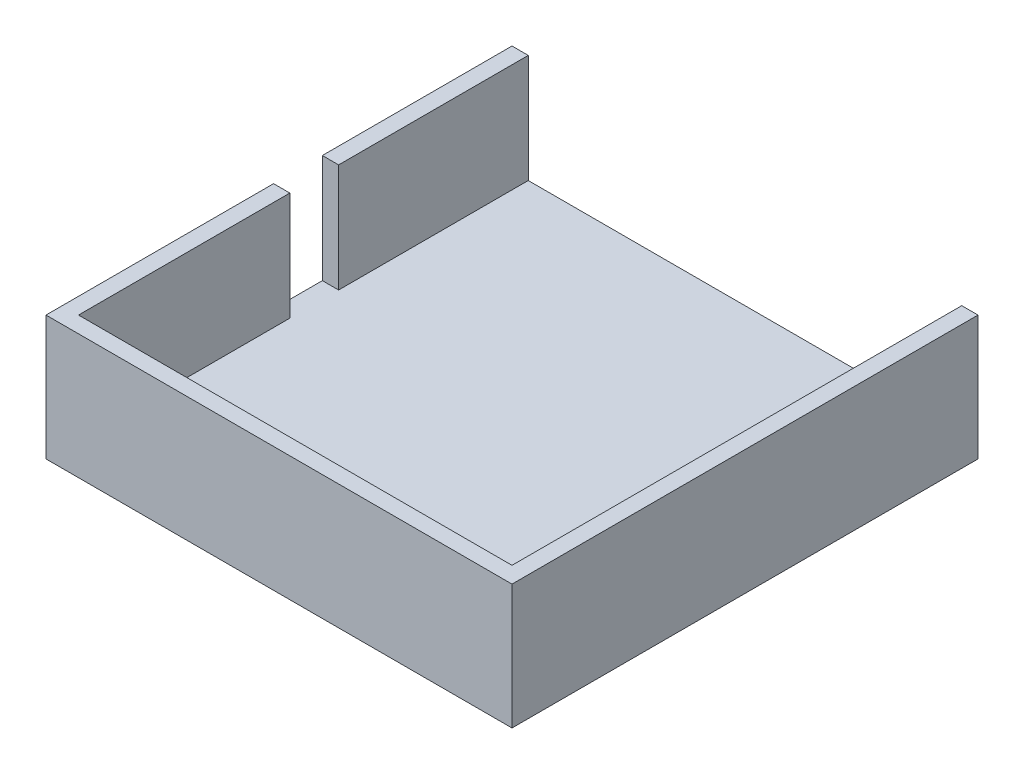
ISO-10303-21;
HEADER;
FILE_DESCRIPTION(('STEP AP214'),'2;1');
FILE_NAME('part.step','',(''),(''),'','','');
FILE_SCHEMA(('AUTOMOTIVE_DESIGN { 1 0 10303 214 1 1 1 1 }'));
ENDSEC;
DATA;
#1=APPLICATION_CONTEXT('core data for automotive mechanical design processes');
#2=APPLICATION_PROTOCOL_DEFINITION('international standard','automotive_design',2000,#1);
#3=PRODUCT_CONTEXT('',#1,'mechanical');
#4=PRODUCT('Part','Part','',(#3));
#5=PRODUCT_RELATED_PRODUCT_CATEGORY('part','',(#4));
#6=PRODUCT_DEFINITION_FORMATION('','',#4);
#7=PRODUCT_DEFINITION_CONTEXT('part definition',#1,'design');
#8=PRODUCT_DEFINITION('design','',#6,#7);
#9=PRODUCT_DEFINITION_SHAPE('','',#8);
#10=(LENGTH_UNIT() NAMED_UNIT(*) SI_UNIT(.MILLI.,.METRE.));
#11=(NAMED_UNIT(*) PLANE_ANGLE_UNIT() SI_UNIT($,.RADIAN.));
#12=(NAMED_UNIT(*) SI_UNIT($,.STERADIAN.) SOLID_ANGLE_UNIT());
#13=UNCERTAINTY_MEASURE_WITH_UNIT(LENGTH_MEASURE(1.E-05),#10,'distance_accuracy_value','');
#14=(GEOMETRIC_REPRESENTATION_CONTEXT(3) GLOBAL_UNCERTAINTY_ASSIGNED_CONTEXT((#13)) GLOBAL_UNIT_ASSIGNED_CONTEXT((#10,
#11,#12)) REPRESENTATION_CONTEXT('',''));
#15=CARTESIAN_POINT('',(0.,0.,0.));
#16=DIRECTION('',(0.,0.,1.));
#17=DIRECTION('',(1.,0.,0.));
#18=AXIS2_PLACEMENT_3D('',#15,#16,#17);
#19=CARTESIAN_POINT('',(0.,23.,0.));
#20=DIRECTION('',(0.,1.,0.));
#21=DIRECTION('',(0.,0.,1.));
#22=AXIS2_PLACEMENT_3D('',#19,#20,#21);
#23=PLANE('',#22);
#24=DIRECTION('',(0.,0.,1.));
#25=VECTOR('',#24,1.);
#26=CARTESIAN_POINT('',(-46.4944466796463,23.,-47.0800834269806));
#27=LINE('',#26,#25);
#28=CARTESIAN_POINT('',(-46.4944466796463,23.,-3.08008342698059));
#29=VERTEX_POINT('',#28);
#30=CARTESIAN_POINT('',(-46.4944466796463,23.,35.9199165730194));
#31=VERTEX_POINT('',#30);
#32=EDGE_CURVE('E136',#29,#31,#27,.T.);
#33=ORIENTED_EDGE('',*,*,#32,.F.);
#34=DIRECTION('',(-1.,0.,0.));
#35=VECTOR('',#34,1.);
#36=CARTESIAN_POINT('',(-46.4944466796463,23.,-3.08008342698059));
#37=LINE('',#36,#35);
#38=CARTESIAN_POINT('',(-49.4944466796463,23.,-3.08008342698059));
#39=VERTEX_POINT('',#38);
#40=EDGE_CURVE('E121',#29,#39,#37,.T.);
#41=ORIENTED_EDGE('',*,*,#40,.T.);
#42=DIRECTION('',(0.,0.,1.));
#43=VECTOR('',#42,1.);
#44=CARTESIAN_POINT('',(-49.4944466796463,23.,-47.0800834269806));
#45=LINE('',#44,#43);
#46=CARTESIAN_POINT('',(-49.4944466796463,23.,38.9199165730194));
#47=VERTEX_POINT('',#46);
#48=EDGE_CURVE('E167',#39,#47,#45,.T.);
#49=ORIENTED_EDGE('',*,*,#48,.T.);
#50=DIRECTION('',(1.,0.,0.));
#51=VECTOR('',#50,1.);
#52=CARTESIAN_POINT('',(-49.4944466796463,23.,38.9199165730194));
#53=LINE('',#52,#51);
#54=CARTESIAN_POINT('',(36.5055533203537,23.,38.9199165730194));
#55=VERTEX_POINT('',#54);
#56=EDGE_CURVE('E166',#47,#55,#53,.T.);
#57=ORIENTED_EDGE('',*,*,#56,.T.);
#58=DIRECTION('',(0.,0.,-1.));
#59=VECTOR('',#58,1.);
#60=CARTESIAN_POINT('',(36.5055533203537,23.,-47.0800834269806));
#61=LINE('',#60,#59);
#62=CARTESIAN_POINT('',(36.5055533203537,23.,-47.0800834269806));
#63=VERTEX_POINT('',#62);
#64=EDGE_CURVE('E169',#55,#63,#61,.T.);
#65=ORIENTED_EDGE('',*,*,#64,.T.);
#66=DIRECTION('',(-1.,0.,0.));
#67=VECTOR('',#66,1.);
#68=CARTESIAN_POINT('',(-49.4944466796463,23.,-47.0800834269806));
#69=LINE('',#68,#67);
#70=CARTESIAN_POINT('',(33.5055533203537,23.,-47.0800834269806));
#71=VERTEX_POINT('',#70);
#72=EDGE_CURVE('E172',#63,#71,#69,.T.);
#73=ORIENTED_EDGE('',*,*,#72,.T.);
#74=DIRECTION('',(0.,0.,-1.));
#75=VECTOR('',#74,1.);
#76=CARTESIAN_POINT('',(33.5055533203537,23.,-47.0800834269806));
#77=LINE('',#76,#75);
#78=CARTESIAN_POINT('',(33.5055533203537,23.,35.9199165730194));
#79=VERTEX_POINT('',#78);
#80=EDGE_CURVE('E155',#79,#71,#77,.T.);
#81=ORIENTED_EDGE('',*,*,#80,.F.);
#82=DIRECTION('',(1.,0.,0.));
#83=VECTOR('',#82,1.);
#84=CARTESIAN_POINT('',(-49.4944466796463,23.,35.9199165730194));
#85=LINE('',#84,#83);
#86=EDGE_CURVE('E144',#31,#79,#85,.T.);
#87=ORIENTED_EDGE('',*,*,#86,.F.);
#88=EDGE_LOOP('',(#33,#41,#49,#57,#65,#73,#81,#87));
#89=FACE_BOUND('',#88,.T.);
#90=ADVANCED_FACE('F32',(#89),#23,.T.);
#91=CARTESIAN_POINT('',(-46.4944466796463,23.,-47.0800834269806));
#92=DIRECTION('',(1.,0.,0.));
#93=DIRECTION('',(0.,0.,-1.));
#94=AXIS2_PLACEMENT_3D('',#91,#92,#93);
#95=PLANE('',#94);
#96=DIRECTION('',(0.,0.,1.));
#97=VECTOR('',#96,1.);
#98=CARTESIAN_POINT('',(-46.4944466796463,3.,-47.0800834269806));
#99=LINE('',#98,#97);
#100=CARTESIAN_POINT('',(-46.4944466796463,3.,-3.08008342698059));
#101=VERTEX_POINT('',#100);
#102=CARTESIAN_POINT('',(-46.4944466796463,3.,35.9199165730194));
#103=VERTEX_POINT('',#102);
#104=EDGE_CURVE('E138',#101,#103,#99,.T.);
#105=ORIENTED_EDGE('',*,*,#104,.F.);
#106=DIRECTION('',(0.,-1.,0.));
#107=VECTOR('',#106,1.);
#108=CARTESIAN_POINT('',(-46.4944466796463,23.,-3.08008342698059));
#109=LINE('',#108,#107);
#110=EDGE_CURVE('E124',#29,#101,#109,.T.);
#111=ORIENTED_EDGE('',*,*,#110,.F.);
#112=ORIENTED_EDGE('',*,*,#32,.T.);
#113=DIRECTION('',(0.,-1.,0.));
#114=VECTOR('',#113,1.);
#115=CARTESIAN_POINT('',(-46.4944466796463,23.,35.9199165730194));
#116=LINE('',#115,#114);
#117=EDGE_CURVE('E180',#31,#103,#116,.T.);
#118=ORIENTED_EDGE('',*,*,#117,.T.);
#119=EDGE_LOOP('',(#105,#111,#112,#118));
#120=FACE_BOUND('',#119,.T.);
#121=ADVANCED_FACE('F134',(#120),#95,.T.);
#122=CARTESIAN_POINT('',(-49.4944466796463,23.,-47.0800834269806));
#123=DIRECTION('',(1.,0.,0.));
#124=DIRECTION('',(0.,0.,-1.));
#125=AXIS2_PLACEMENT_3D('',#122,#123,#124);
#126=PLANE('',#125);
#127=DIRECTION('',(0.,0.,1.));
#128=VECTOR('',#127,1.);
#129=CARTESIAN_POINT('',(-49.4944466796463,3.,-12.0800834269806));
#130=LINE('',#129,#128);
#131=CARTESIAN_POINT('',(-49.4944466796463,3.,-12.0800834269806));
#132=VERTEX_POINT('',#131);
#133=CARTESIAN_POINT('',(-49.4944466796463,3.,-3.08008342698059));
#134=VERTEX_POINT('',#133);
#135=EDGE_CURVE('E269',#132,#134,#130,.T.);
#136=ORIENTED_EDGE('',*,*,#135,.F.);
#137=DIRECTION('',(0.,-1.,0.));
#138=VECTOR('',#137,1.);
#139=CARTESIAN_POINT('',(-49.4944466796463,23.,-12.0800834269806));
#140=LINE('',#139,#138);
#141=CARTESIAN_POINT('',(-49.4944466796463,23.,-12.0800834269806));
#142=VERTEX_POINT('',#141);
#143=EDGE_CURVE('E140',#142,#132,#140,.T.);
#144=ORIENTED_EDGE('',*,*,#143,.F.);
#145=CARTESIAN_POINT('',(-49.4944466796463,23.,-47.0800834269806));
#146=VERTEX_POINT('',#145);
#147=EDGE_CURVE('E163',#146,#142,#45,.T.);
#148=ORIENTED_EDGE('',*,*,#147,.F.);
#149=DIRECTION('',(0.,-1.,0.));
#150=VECTOR('',#149,1.);
#151=CARTESIAN_POINT('',(-49.4944466796463,23.,-47.0800834269806));
#152=LINE('',#151,#150);
#153=CARTESIAN_POINT('',(-49.4944466796463,0.,-47.0800834269806));
#154=VERTEX_POINT('',#153);
#155=EDGE_CURVE('E175',#146,#154,#152,.T.);
#156=ORIENTED_EDGE('',*,*,#155,.T.);
#157=DIRECTION('',(0.,0.,1.));
#158=VECTOR('',#157,1.);
#159=CARTESIAN_POINT('',(-49.4944466796463,0.,-47.0800834269806));
#160=LINE('',#159,#158);
#161=CARTESIAN_POINT('',(-49.4944466796463,0.,38.9199165730194));
#162=VERTEX_POINT('',#161);
#163=EDGE_CURVE('E176',#154,#162,#160,.T.);
#164=ORIENTED_EDGE('',*,*,#163,.T.);
#165=DIRECTION('',(0.,-1.,0.));
#166=VECTOR('',#165,1.);
#167=CARTESIAN_POINT('',(-49.4944466796463,23.,38.9199165730194));
#168=LINE('',#167,#166);
#169=EDGE_CURVE('E11',#47,#162,#168,.T.);
#170=ORIENTED_EDGE('',*,*,#169,.F.);
#171=ORIENTED_EDGE('',*,*,#48,.F.);
#172=DIRECTION('',(0.,-1.,0.));
#173=VECTOR('',#172,1.);
#174=CARTESIAN_POINT('',(-49.4944466796463,23.,-3.08008342698059));
#175=LINE('',#174,#173);
#176=EDGE_CURVE('E127',#39,#134,#175,.T.);
#177=ORIENTED_EDGE('',*,*,#176,.T.);
#178=EDGE_LOOP('',(#136,#144,#148,#156,#164,#170,#171,#177));
#179=FACE_BOUND('',#178,.T.);
#180=ADVANCED_FACE('F34',(#179),#126,.F.);
#181=CARTESIAN_POINT('',(-49.4944466796463,23.,38.9199165730194));
#182=DIRECTION('',(0.,0.,-1.));
#183=DIRECTION('',(-1.,0.,0.));
#184=AXIS2_PLACEMENT_3D('',#181,#182,#183);
#185=PLANE('',#184);
#186=DIRECTION('',(1.,0.,0.));
#187=VECTOR('',#186,1.);
#188=CARTESIAN_POINT('',(-49.4944466796463,0.,38.9199165730194));
#189=LINE('',#188,#187);
#190=CARTESIAN_POINT('',(36.5055533203537,0.,38.9199165730194));
#191=VERTEX_POINT('',#190);
#192=EDGE_CURVE('E179',#162,#191,#189,.T.);
#193=ORIENTED_EDGE('',*,*,#192,.T.);
#194=DIRECTION('',(0.,-1.,0.));
#195=VECTOR('',#194,1.);
#196=CARTESIAN_POINT('',(36.5055533203537,23.,38.9199165730194));
#197=LINE('',#196,#195);
#198=EDGE_CURVE('E40',#55,#191,#197,.T.);
#199=ORIENTED_EDGE('',*,*,#198,.F.);
#200=ORIENTED_EDGE('',*,*,#56,.F.);
#201=ORIENTED_EDGE('',*,*,#169,.T.);
#202=EDGE_LOOP('',(#193,#199,#200,#201));
#203=FACE_BOUND('',#202,.T.);
#204=ADVANCED_FACE('F263',(#203),#185,.F.);
#205=CARTESIAN_POINT('',(36.5055533203537,23.,-47.0800834269806));
#206=DIRECTION('',(-1.,0.,0.));
#207=DIRECTION('',(0.,0.,1.));
#208=AXIS2_PLACEMENT_3D('',#205,#206,#207);
#209=PLANE('',#208);
#210=DIRECTION('',(0.,0.,-1.));
#211=VECTOR('',#210,1.);
#212=CARTESIAN_POINT('',(36.5055533203537,0.,-47.0800834269806));
#213=LINE('',#212,#211);
#214=CARTESIAN_POINT('',(36.5055533203537,0.,-47.0800834269806));
#215=VERTEX_POINT('',#214);
#216=EDGE_CURVE('E182',#191,#215,#213,.T.);
#217=ORIENTED_EDGE('',*,*,#216,.T.);
#218=DIRECTION('',(0.,-1.,0.));
#219=VECTOR('',#218,1.);
#220=CARTESIAN_POINT('',(36.5055533203537,23.,-47.0800834269806));
#221=LINE('',#220,#219);
#222=EDGE_CURVE('E188',#63,#215,#221,.T.);
#223=ORIENTED_EDGE('',*,*,#222,.F.);
#224=ORIENTED_EDGE('',*,*,#64,.F.);
#225=ORIENTED_EDGE('',*,*,#198,.T.);
#226=EDGE_LOOP('',(#217,#223,#224,#225));
#227=FACE_BOUND('',#226,.T.);
#228=ADVANCED_FACE('F195',(#227),#209,.F.);
#229=CARTESIAN_POINT('',(-49.4944466796463,23.,-47.0800834269806));
#230=DIRECTION('',(0.,0.,1.));
#231=DIRECTION('',(1.,0.,0.));
#232=AXIS2_PLACEMENT_3D('',#229,#230,#231);
#233=PLANE('',#232);
#234=CARTESIAN_POINT('',(-46.4944466796463,23.,-47.0800834269806));
#235=VERTEX_POINT('',#234);
#236=EDGE_CURVE('E171',#235,#146,#69,.T.);
#237=ORIENTED_EDGE('',*,*,#236,.F.);
#238=DIRECTION('',(0.,-1.,0.));
#239=VECTOR('',#238,1.);
#240=CARTESIAN_POINT('',(-46.4944466796463,23.,-47.0800834269806));
#241=LINE('',#240,#239);
#242=CARTESIAN_POINT('',(-46.4944466796463,3.,-47.0800834269806));
#243=VERTEX_POINT('',#242);
#244=EDGE_CURVE('E157',#235,#243,#241,.T.);
#245=ORIENTED_EDGE('',*,*,#244,.T.);
#246=DIRECTION('',(-1.,0.,0.));
#247=VECTOR('',#246,1.);
#248=CARTESIAN_POINT('',(-49.4944466796463,3.,-47.0800834269806));
#249=LINE('',#248,#247);
#250=CARTESIAN_POINT('',(33.5055533203537,3.,-47.0800834269806));
#251=VERTEX_POINT('',#250);
#252=EDGE_CURVE('E146',#251,#243,#249,.T.);
#253=ORIENTED_EDGE('',*,*,#252,.F.);
#254=DIRECTION('',(0.,-1.,0.));
#255=VECTOR('',#254,1.);
#256=CARTESIAN_POINT('',(33.5055533203537,23.,-47.0800834269806));
#257=LINE('',#256,#255);
#258=EDGE_CURVE('E158',#71,#251,#257,.T.);
#259=ORIENTED_EDGE('',*,*,#258,.F.);
#260=ORIENTED_EDGE('',*,*,#72,.F.);
#261=ORIENTED_EDGE('',*,*,#222,.T.);
#262=DIRECTION('',(-1.,0.,0.));
#263=VECTOR('',#262,1.);
#264=CARTESIAN_POINT('',(-49.4944466796463,0.,-47.0800834269806));
#265=LINE('',#264,#263);
#266=EDGE_CURVE('E184',#215,#154,#265,.T.);
#267=ORIENTED_EDGE('',*,*,#266,.T.);
#268=ORIENTED_EDGE('',*,*,#155,.F.);
#269=EDGE_LOOP('',(#237,#245,#253,#259,#260,#261,#267,#268));
#270=FACE_BOUND('',#269,.T.);
#271=ADVANCED_FACE('F206',(#270),#233,.F.);
#272=DIRECTION('',(-1.,0.,0.));
#273=VECTOR('',#272,1.);
#274=CARTESIAN_POINT('',(-46.4944466796463,23.,-12.0800834269806));
#275=LINE('',#274,#273);
#276=CARTESIAN_POINT('',(-46.4944466796463,23.,-12.0800834269806));
#277=VERTEX_POINT('',#276);
#278=EDGE_CURVE('E131',#277,#142,#275,.T.);
#279=ORIENTED_EDGE('',*,*,#278,.F.);
#280=EDGE_CURVE('E145',#235,#277,#27,.T.);
#281=ORIENTED_EDGE('',*,*,#280,.F.);
#282=ORIENTED_EDGE('',*,*,#236,.T.);
#283=ORIENTED_EDGE('',*,*,#147,.T.);
#284=EDGE_LOOP('',(#279,#281,#282,#283));
#285=FACE_BOUND('',#284,.T.);
#286=ADVANCED_FACE('F216',(#285),#23,.T.);
#287=CARTESIAN_POINT('',(0.,0.,0.));
#288=DIRECTION('',(0.,1.,0.));
#289=DIRECTION('',(0.,0.,1.));
#290=AXIS2_PLACEMENT_3D('',#287,#288,#289);
#291=PLANE('',#290);
#292=ORIENTED_EDGE('',*,*,#163,.F.);
#293=ORIENTED_EDGE('',*,*,#266,.F.);
#294=ORIENTED_EDGE('',*,*,#216,.F.);
#295=ORIENTED_EDGE('',*,*,#192,.F.);
#296=EDGE_LOOP('',(#292,#293,#294,#295));
#297=FACE_BOUND('',#296,.T.);
#298=ADVANCED_FACE('F202',(#297),#291,.F.);
#299=DIRECTION('',(0.,-1.,0.));
#300=VECTOR('',#299,1.);
#301=CARTESIAN_POINT('',(-46.4944466796463,23.,-12.0800834269806));
#302=LINE('',#301,#300);
#303=CARTESIAN_POINT('',(-46.4944466796463,3.,-12.0800834269806));
#304=VERTEX_POINT('',#303);
#305=EDGE_CURVE('E139',#277,#304,#302,.T.);
#306=ORIENTED_EDGE('',*,*,#305,.T.);
#307=EDGE_CURVE('E225',#243,#304,#99,.T.);
#308=ORIENTED_EDGE('',*,*,#307,.F.);
#309=ORIENTED_EDGE('',*,*,#244,.F.);
#310=ORIENTED_EDGE('',*,*,#280,.T.);
#311=EDGE_LOOP('',(#306,#308,#309,#310));
#312=FACE_BOUND('',#311,.T.);
#313=ADVANCED_FACE('F223',(#312),#95,.T.);
#314=CARTESIAN_POINT('',(-49.4944466796463,23.,35.9199165730194));
#315=DIRECTION('',(0.,0.,-1.));
#316=DIRECTION('',(-1.,0.,0.));
#317=AXIS2_PLACEMENT_3D('',#314,#315,#316);
#318=PLANE('',#317);
#319=DIRECTION('',(1.,0.,0.));
#320=VECTOR('',#319,1.);
#321=CARTESIAN_POINT('',(-49.4944466796463,3.,35.9199165730194));
#322=LINE('',#321,#320);
#323=CARTESIAN_POINT('',(33.5055533203537,3.,35.9199165730194));
#324=VERTEX_POINT('',#323);
#325=EDGE_CURVE('E226',#103,#324,#322,.T.);
#326=ORIENTED_EDGE('',*,*,#325,.F.);
#327=ORIENTED_EDGE('',*,*,#117,.F.);
#328=ORIENTED_EDGE('',*,*,#86,.T.);
#329=DIRECTION('',(0.,-1.,0.));
#330=VECTOR('',#329,1.);
#331=CARTESIAN_POINT('',(33.5055533203537,23.,35.9199165730194));
#332=LINE('',#331,#330);
#333=EDGE_CURVE('E55',#79,#324,#332,.T.);
#334=ORIENTED_EDGE('',*,*,#333,.T.);
#335=EDGE_LOOP('',(#326,#327,#328,#334));
#336=FACE_BOUND('',#335,.T.);
#337=ADVANCED_FACE('F234',(#336),#318,.T.);
#338=CARTESIAN_POINT('',(33.5055533203537,23.,-47.0800834269806));
#339=DIRECTION('',(-1.,0.,0.));
#340=DIRECTION('',(0.,0.,1.));
#341=AXIS2_PLACEMENT_3D('',#338,#339,#340);
#342=PLANE('',#341);
#343=DIRECTION('',(0.,0.,-1.));
#344=VECTOR('',#343,1.);
#345=CARTESIAN_POINT('',(33.5055533203537,3.,-47.0800834269806));
#346=LINE('',#345,#344);
#347=EDGE_CURVE('E149',#324,#251,#346,.T.);
#348=ORIENTED_EDGE('',*,*,#347,.F.);
#349=ORIENTED_EDGE('',*,*,#333,.F.);
#350=ORIENTED_EDGE('',*,*,#80,.T.);
#351=ORIENTED_EDGE('',*,*,#258,.T.);
#352=EDGE_LOOP('',(#348,#349,#350,#351));
#353=FACE_BOUND('',#352,.T.);
#354=ADVANCED_FACE('F235',(#353),#342,.T.);
#355=CARTESIAN_POINT('',(0.,3.,0.));
#356=DIRECTION('',(0.,1.,0.));
#357=DIRECTION('',(0.,0.,1.));
#358=AXIS2_PLACEMENT_3D('',#355,#356,#357);
#359=PLANE('',#358);
#360=ORIENTED_EDGE('',*,*,#307,.T.);
#361=DIRECTION('',(-1.,0.,0.));
#362=VECTOR('',#361,1.);
#363=CARTESIAN_POINT('',(-46.4944466796463,3.,-12.0800834269806));
#364=LINE('',#363,#362);
#365=EDGE_CURVE('E229',#304,#132,#364,.T.);
#366=ORIENTED_EDGE('',*,*,#365,.T.);
#367=ORIENTED_EDGE('',*,*,#135,.T.);
#368=DIRECTION('',(-1.,0.,0.));
#369=VECTOR('',#368,1.);
#370=CARTESIAN_POINT('',(-46.4944466796463,3.,-3.08008342698059));
#371=LINE('',#370,#369);
#372=EDGE_CURVE('E47',#101,#134,#371,.T.);
#373=ORIENTED_EDGE('',*,*,#372,.F.);
#374=ORIENTED_EDGE('',*,*,#104,.T.);
#375=ORIENTED_EDGE('',*,*,#325,.T.);
#376=ORIENTED_EDGE('',*,*,#347,.T.);
#377=ORIENTED_EDGE('',*,*,#252,.T.);
#378=EDGE_LOOP('',(#360,#366,#367,#373,#374,#375,#376,#377));
#379=FACE_BOUND('',#378,.T.);
#380=ADVANCED_FACE('F236',(#379),#359,.T.);
#381=CARTESIAN_POINT('',(-46.4944466796463,23.,-12.0800834269806));
#382=DIRECTION('',(0.,0.,-1.));
#383=DIRECTION('',(-1.,0.,0.));
#384=AXIS2_PLACEMENT_3D('',#381,#382,#383);
#385=PLANE('',#384);
#386=ORIENTED_EDGE('',*,*,#143,.T.);
#387=ORIENTED_EDGE('',*,*,#365,.F.);
#388=ORIENTED_EDGE('',*,*,#305,.F.);
#389=ORIENTED_EDGE('',*,*,#278,.T.);
#390=EDGE_LOOP('',(#386,#387,#388,#389));
#391=FACE_BOUND('',#390,.T.);
#392=ADVANCED_FACE('F238',(#391),#385,.F.);
#393=CARTESIAN_POINT('',(-46.4944466796463,23.,-3.08008342698059));
#394=DIRECTION('',(0.,0.,-1.));
#395=DIRECTION('',(-1.,0.,0.));
#396=AXIS2_PLACEMENT_3D('',#393,#394,#395);
#397=PLANE('',#396);
#398=ORIENTED_EDGE('',*,*,#176,.F.);
#399=ORIENTED_EDGE('',*,*,#40,.F.);
#400=ORIENTED_EDGE('',*,*,#110,.T.);
#401=ORIENTED_EDGE('',*,*,#372,.T.);
#402=EDGE_LOOP('',(#398,#399,#400,#401));
#403=FACE_BOUND('',#402,.T.);
#404=ADVANCED_FACE('F123',(#403),#397,.T.);
#405=CLOSED_SHELL('',(#90,#121,#180,#204,#228,#271,#286,#298,#313,#337,#354,#380,#392,#404));
#406=MANIFOLD_SOLID_BREP('B2',#405);
#407=ADVANCED_BREP_SHAPE_REPRESENTATION('',(#18,#406),#14);
#408=SHAPE_DEFINITION_REPRESENTATION(#9,#407);
ENDSEC;
END-ISO-10303-21;
